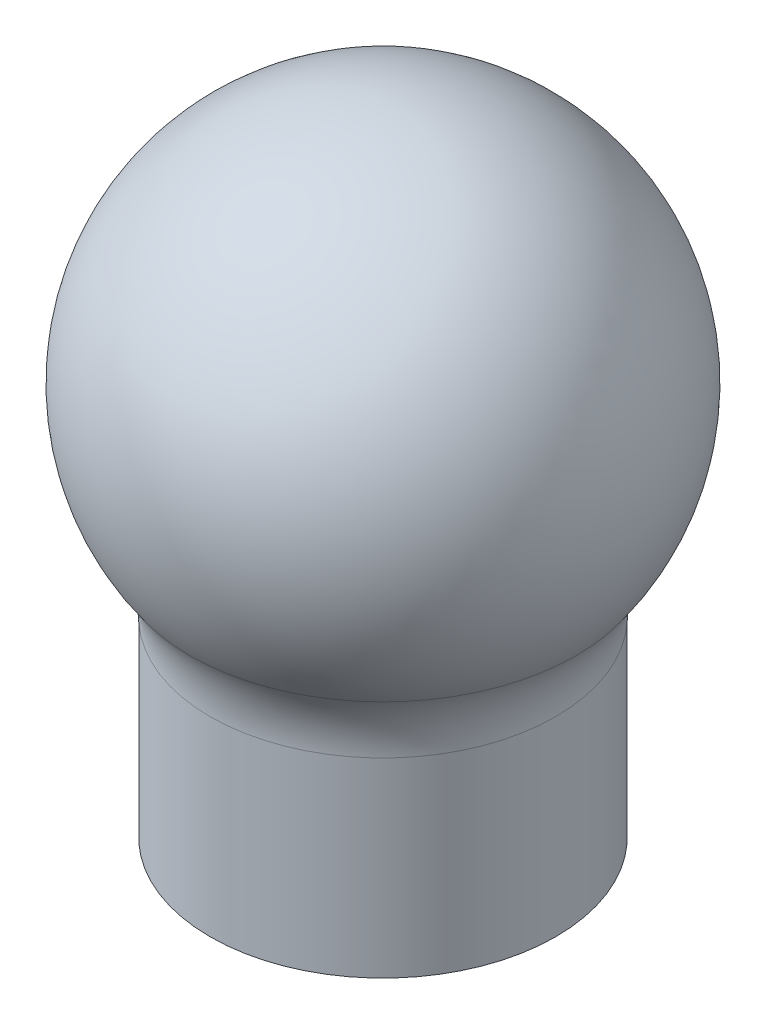
ISO-10303-21;
HEADER;
FILE_DESCRIPTION(('STEP AP214'),'2;1');
FILE_NAME('part.step','',(''),(''),'','','');
FILE_SCHEMA(('AUTOMOTIVE_DESIGN { 1 0 10303 214 1 1 1 1 }'));
ENDSEC;
DATA;
#1=APPLICATION_CONTEXT('core data for automotive mechanical design processes');
#2=APPLICATION_PROTOCOL_DEFINITION('international standard','automotive_design',2000,#1);
#3=PRODUCT_CONTEXT('',#1,'mechanical');
#4=PRODUCT('Part','Part','',(#3));
#5=PRODUCT_RELATED_PRODUCT_CATEGORY('part','',(#4));
#6=PRODUCT_DEFINITION_FORMATION('','',#4);
#7=PRODUCT_DEFINITION_CONTEXT('part definition',#1,'design');
#8=PRODUCT_DEFINITION('design','',#6,#7);
#9=PRODUCT_DEFINITION_SHAPE('','',#8);
#10=(LENGTH_UNIT() NAMED_UNIT(*) SI_UNIT(.MILLI.,.METRE.));
#11=(NAMED_UNIT(*) PLANE_ANGLE_UNIT() SI_UNIT($,.RADIAN.));
#12=(NAMED_UNIT(*) SI_UNIT($,.STERADIAN.) SOLID_ANGLE_UNIT());
#13=UNCERTAINTY_MEASURE_WITH_UNIT(LENGTH_MEASURE(1.E-05),#10,'distance_accuracy_value','');
#14=(GEOMETRIC_REPRESENTATION_CONTEXT(3) GLOBAL_UNCERTAINTY_ASSIGNED_CONTEXT((#13)) GLOBAL_UNIT_ASSIGNED_CONTEXT((#10,
#11,#12)) REPRESENTATION_CONTEXT('',''));
#15=CARTESIAN_POINT('',(0.,0.,0.));
#16=DIRECTION('',(0.,0.,1.));
#17=DIRECTION('',(1.,0.,0.));
#18=AXIS2_PLACEMENT_3D('',#15,#16,#17);
#19=CARTESIAN_POINT('',(0.,32.,0.));
#20=DIRECTION('',(0.,-1.,0.));
#21=DIRECTION('',(0.,0.,-1.));
#22=AXIS2_PLACEMENT_3D('',#19,#20,#21);
#23=CYLINDRICAL_SURFACE('',#22,29.);
#24=CARTESIAN_POINT('',(0.,32.,0.));
#25=DIRECTION('',(0.,1.,0.));
#26=DIRECTION('',(0.,0.,1.));
#27=AXIS2_PLACEMENT_3D('',#24,#25,#26);
#28=CIRCLE('',#27,29.);
#29=CARTESIAN_POINT('',(0.,32.,29.));
#30=VERTEX_POINT('',#29);
#31=EDGE_CURVE('E10',#30,#30,#28,.T.);
#32=ORIENTED_EDGE('',*,*,#31,.F.);
#33=EDGE_LOOP('',(#32));
#34=FACE_BOUND('',#33,.T.);
#35=CARTESIAN_POINT('',(0.,0.,0.));
#36=DIRECTION('',(0.,1.,0.));
#37=DIRECTION('',(0.,0.,1.));
#38=AXIS2_PLACEMENT_3D('',#35,#36,#37);
#39=CIRCLE('',#38,29.);
#40=CARTESIAN_POINT('',(0.,0.,29.));
#41=VERTEX_POINT('',#40);
#42=EDGE_CURVE('E43',#41,#41,#39,.T.);
#43=ORIENTED_EDGE('',*,*,#42,.T.);
#44=EDGE_LOOP('',(#43));
#45=FACE_BOUND('',#44,.T.);
#46=ADVANCED_FACE('F40',(#34,#45),#23,.T.);
#47=CARTESIAN_POINT('',(0.,0.,0.));
#48=DIRECTION('',(0.,1.,0.));
#49=DIRECTION('',(0.,0.,1.));
#50=AXIS2_PLACEMENT_3D('',#47,#48,#49);
#51=PLANE('',#50);
#52=ORIENTED_EDGE('',*,*,#42,.F.);
#53=EDGE_LOOP('',(#52));
#54=FACE_BOUND('',#53,.T.);
#55=ADVANCED_FACE('F62',(#54),#51,.F.);
#56=CARTESIAN_POINT('',(0.,66.,0.));
#57=DIRECTION('',(0.,-1.,0.));
#58=DIRECTION('',(-1.,0.,0.));
#59=AXIS2_PLACEMENT_3D('',#56,#57,#58);
#60=SPHERICAL_SURFACE('',#59,40.);
#61=CARTESIAN_POINT('',(0.,42.5700861393892,0.));
#62=DIRECTION('',(0.,-1.,0.));
#63=DIRECTION('',(0.,0.,-1.));
#64=AXIS2_PLACEMENT_3D('',#61,#62,#63);
#65=CIRCLE('',#64,32.4197337509789);
#66=CARTESIAN_POINT('',(0.,42.5700861393892,-32.4197337509789));
#67=VERTEX_POINT('',#66);
#68=EDGE_CURVE('E52',#67,#67,#65,.T.);
#69=ORIENTED_EDGE('',*,*,#68,.F.);
#70=EDGE_LOOP('',(#69));
#71=FACE_BOUND('',#70,.T.);
#72=ADVANCED_FACE('F60',(#71),#60,.T.);
#73=CARTESIAN_POINT('',(0.,32.,0.));
#74=DIRECTION('',(0.,-1.,0.));
#75=DIRECTION('',(0.,0.,-1.));
#76=AXIS2_PLACEMENT_3D('',#73,#74,#75);
#77=TOROIDAL_SURFACE('',#76,47.0454545454545,18.0454545454545);
#78=ORIENTED_EDGE('',*,*,#31,.T.);
#79=EDGE_LOOP('',(#78));
#80=FACE_BOUND('',#79,.T.);
#81=ORIENTED_EDGE('',*,*,#68,.T.);
#82=EDGE_LOOP('',(#81));
#83=FACE_BOUND('',#82,.T.);
#84=ADVANCED_FACE('F58',(#80,#83),#77,.F.);
#85=CLOSED_SHELL('',(#46,#55,#72,#84));
#86=MANIFOLD_SOLID_BREP('B2',#85);
#87=ADVANCED_BREP_SHAPE_REPRESENTATION('',(#18,#86),#14);
#88=SHAPE_DEFINITION_REPRESENTATION(#9,#87);
ENDSEC;
END-ISO-10303-21;
